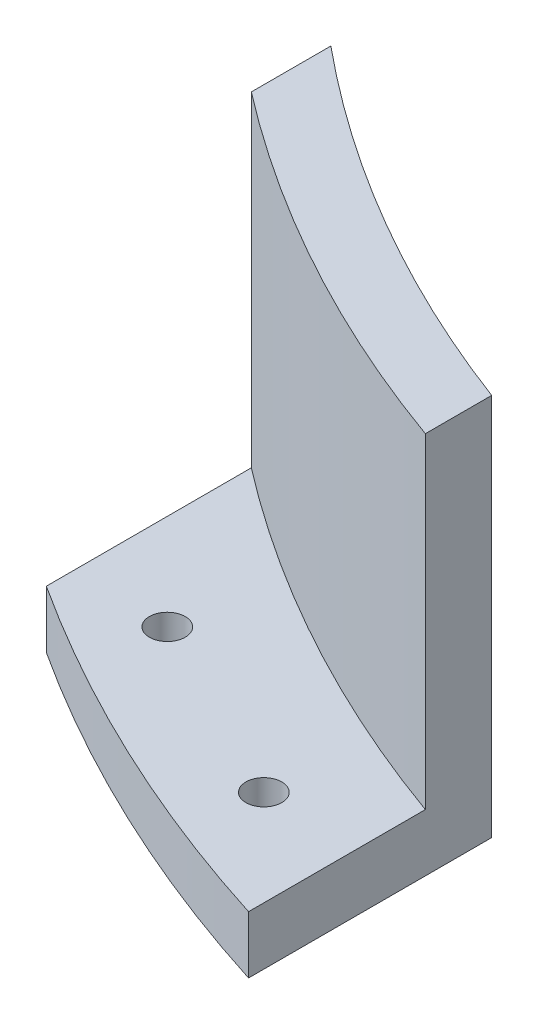
ISO-10303-21;
HEADER;
FILE_DESCRIPTION(('STEP AP214'),'2;1');
FILE_NAME('part.step','',(''),(''),'','','');
FILE_SCHEMA(('AUTOMOTIVE_DESIGN { 1 0 10303 214 1 1 1 1 }'));
ENDSEC;
DATA;
#1=APPLICATION_CONTEXT('core data for automotive mechanical design processes');
#2=APPLICATION_PROTOCOL_DEFINITION('international standard','automotive_design',2000,#1);
#3=PRODUCT_CONTEXT('',#1,'mechanical');
#4=PRODUCT('Part','Part','',(#3));
#5=PRODUCT_RELATED_PRODUCT_CATEGORY('part','',(#4));
#6=PRODUCT_DEFINITION_FORMATION('','',#4);
#7=PRODUCT_DEFINITION_CONTEXT('part definition',#1,'design');
#8=PRODUCT_DEFINITION('design','',#6,#7);
#9=PRODUCT_DEFINITION_SHAPE('','',#8);
#10=(LENGTH_UNIT() NAMED_UNIT(*) SI_UNIT(.MILLI.,.METRE.));
#11=(NAMED_UNIT(*) PLANE_ANGLE_UNIT() SI_UNIT($,.RADIAN.));
#12=(NAMED_UNIT(*) SI_UNIT($,.STERADIAN.) SOLID_ANGLE_UNIT());
#13=UNCERTAINTY_MEASURE_WITH_UNIT(LENGTH_MEASURE(1.E-05),#10,'distance_accuracy_value','');
#14=(GEOMETRIC_REPRESENTATION_CONTEXT(3) GLOBAL_UNCERTAINTY_ASSIGNED_CONTEXT((#13)) GLOBAL_UNIT_ASSIGNED_CONTEXT((#10,
#11,#12)) REPRESENTATION_CONTEXT('',''));
#15=CARTESIAN_POINT('',(0.,0.,0.));
#16=DIRECTION('',(0.,0.,1.));
#17=DIRECTION('',(1.,0.,0.));
#18=AXIS2_PLACEMENT_3D('',#15,#16,#17);
#19=CARTESIAN_POINT('',(-114.033720515136,50.8,0.));
#20=DIRECTION('',(1.,0.,0.));
#21=DIRECTION('',(0.,0.,-1.));
#22=AXIS2_PLACEMENT_3D('',#19,#20,#21);
#23=PLANE('',#22);
#24=DIRECTION('',(0.,0.,1.));
#25=VECTOR('',#24,1.);
#26=CARTESIAN_POINT('',(-114.033720515136,7.62,0.));
#27=LINE('',#26,#25);
#28=CARTESIAN_POINT('',(-114.033720515136,7.62,148.616843629771));
#29=VERTEX_POINT('',#28);
#30=CARTESIAN_POINT('',(-114.033720515136,7.62,175.805327238613));
#31=VERTEX_POINT('',#30);
#32=EDGE_CURVE('E99',#29,#31,#27,.T.);
#33=ORIENTED_EDGE('',*,*,#32,.F.);
#34=DIRECTION('',(0.,1.,0.));
#35=VECTOR('',#34,1.);
#36=CARTESIAN_POINT('',(-114.033720515136,7.62,148.616843629771));
#37=LINE('',#36,#35);
#38=CARTESIAN_POINT('',(-114.033720515136,50.8,148.616843629771));
#39=VERTEX_POINT('',#38);
#40=EDGE_CURVE('E131',#39,#29,#37,.F.);
#41=ORIENTED_EDGE('',*,*,#40,.F.);
#42=DIRECTION('',(0.,0.,1.));
#43=VECTOR('',#42,1.);
#44=CARTESIAN_POINT('',(-114.033720515136,50.8,0.));
#45=LINE('',#44,#43);
#46=CARTESIAN_POINT('',(-114.033720515136,50.8,138.066561793491));
#47=VERTEX_POINT('',#46);
#48=EDGE_CURVE('E86',#47,#39,#45,.T.);
#49=ORIENTED_EDGE('',*,*,#48,.F.);
#50=DIRECTION('',(0.,-1.,0.));
#51=VECTOR('',#50,1.);
#52=CARTESIAN_POINT('',(-114.033720515136,50.8,138.066561793491));
#53=LINE('',#52,#51);
#54=CARTESIAN_POINT('',(-114.033720515136,0.,138.066561793491));
#55=VERTEX_POINT('',#54);
#56=EDGE_CURVE('E62',#47,#55,#53,.T.);
#57=ORIENTED_EDGE('',*,*,#56,.T.);
#58=DIRECTION('',(0.,0.,1.));
#59=VECTOR('',#58,1.);
#60=CARTESIAN_POINT('',(-114.033720515136,0.,0.));
#61=LINE('',#60,#59);
#62=CARTESIAN_POINT('',(-114.033720515136,0.,175.805327238613));
#63=VERTEX_POINT('',#62);
#64=EDGE_CURVE('E83',#55,#63,#61,.T.);
#65=ORIENTED_EDGE('',*,*,#64,.T.);
#66=DIRECTION('',(0.,-1.,0.));
#67=VECTOR('',#66,1.);
#68=CARTESIAN_POINT('',(-114.033720515136,50.8,175.805327238613));
#69=LINE('',#68,#67);
#70=EDGE_CURVE('E46',#31,#63,#69,.T.);
#71=ORIENTED_EDGE('',*,*,#70,.F.);
#72=EDGE_LOOP('',(#33,#41,#49,#57,#65,#71));
#73=FACE_BOUND('',#72,.T.);
#74=ADVANCED_FACE('F39',(#73),#23,.F.);
#75=CARTESIAN_POINT('',(0.,50.8,0.));
#76=DIRECTION('',(0.,-1.,0.));
#77=DIRECTION('',(0.,0.,-1.));
#78=AXIS2_PLACEMENT_3D('',#75,#76,#77);
#79=CYLINDRICAL_SURFACE('',#78,209.55);
#80=CARTESIAN_POINT('',(0.,7.62,0.));
#81=DIRECTION('',(0.,1.,0.));
#82=DIRECTION('',(0.,0.,1.));
#83=AXIS2_PLACEMENT_3D('',#80,#81,#82);
#84=CIRCLE('',#83,209.55);
#85=CARTESIAN_POINT('',(-63.2337205151356,7.62,199.781628509264));
#86=VERTEX_POINT('',#85);
#87=EDGE_CURVE('E118',#31,#86,#84,.T.);
#88=ORIENTED_EDGE('',*,*,#87,.F.);
#89=ORIENTED_EDGE('',*,*,#70,.T.);
#90=CARTESIAN_POINT('',(0.,0.,0.));
#91=DIRECTION('',(0.,1.,0.));
#92=DIRECTION('',(0.,0.,1.));
#93=AXIS2_PLACEMENT_3D('',#90,#91,#92);
#94=CIRCLE('',#93,209.55);
#95=CARTESIAN_POINT('',(-63.2337205151356,0.,199.781628509264));
#96=VERTEX_POINT('',#95);
#97=EDGE_CURVE('E98',#63,#96,#94,.T.);
#98=ORIENTED_EDGE('',*,*,#97,.T.);
#99=DIRECTION('',(0.,-1.,0.));
#100=VECTOR('',#99,1.);
#101=CARTESIAN_POINT('',(-63.2337205151356,50.8,199.781628509264));
#102=LINE('',#101,#100);
#103=EDGE_CURVE('E111',#86,#96,#102,.T.);
#104=ORIENTED_EDGE('',*,*,#103,.F.);
#105=EDGE_LOOP('',(#88,#89,#98,#104));
#106=FACE_BOUND('',#105,.T.);
#107=ADVANCED_FACE('F114',(#106),#79,.T.);
#108=CARTESIAN_POINT('',(-63.2337205151355,50.8,0.));
#109=DIRECTION('',(1.,0.,0.));
#110=DIRECTION('',(0.,0.,-1.));
#111=AXIS2_PLACEMENT_3D('',#108,#109,#110);
#112=PLANE('',#111);
#113=DIRECTION('',(0.,1.,0.));
#114=VECTOR('',#113,1.);
#115=CARTESIAN_POINT('',(-63.2337205151356,7.62,176.329669128067));
#116=LINE('',#115,#114);
#117=CARTESIAN_POINT('',(-63.2337205151356,50.8,176.329669128067));
#118=VERTEX_POINT('',#117);
#119=CARTESIAN_POINT('',(-63.2337205151356,7.62,176.329669128067));
#120=VERTEX_POINT('',#119);
#121=EDGE_CURVE('E53',#118,#120,#116,.F.);
#122=ORIENTED_EDGE('',*,*,#121,.T.);
#123=DIRECTION('',(0.,0.,1.));
#124=VECTOR('',#123,1.);
#125=CARTESIAN_POINT('',(-63.2337205151355,7.62,0.));
#126=LINE('',#125,#124);
#127=EDGE_CURVE('E11',#120,#86,#126,.T.);
#128=ORIENTED_EDGE('',*,*,#127,.T.);
#129=ORIENTED_EDGE('',*,*,#103,.T.);
#130=DIRECTION('',(0.,0.,1.));
#131=VECTOR('',#130,1.);
#132=CARTESIAN_POINT('',(-63.2337205151355,0.,0.));
#133=LINE('',#132,#131);
#134=CARTESIAN_POINT('',(-63.2337205151356,0.,167.533762238582));
#135=VERTEX_POINT('',#134);
#136=EDGE_CURVE('E103',#135,#96,#133,.T.);
#137=ORIENTED_EDGE('',*,*,#136,.F.);
#138=DIRECTION('',(0.,-1.,0.));
#139=VECTOR('',#138,1.);
#140=CARTESIAN_POINT('',(-63.2337205151356,50.8,167.533762238582));
#141=LINE('',#140,#139);
#142=CARTESIAN_POINT('',(-63.2337205151356,50.8,167.533762238582));
#143=VERTEX_POINT('',#142);
#144=EDGE_CURVE('E88',#143,#135,#141,.T.);
#145=ORIENTED_EDGE('',*,*,#144,.F.);
#146=DIRECTION('',(0.,0.,1.));
#147=VECTOR('',#146,1.);
#148=CARTESIAN_POINT('',(-63.2337205151355,50.8,0.));
#149=LINE('',#148,#147);
#150=EDGE_CURVE('E105',#143,#118,#149,.T.);
#151=ORIENTED_EDGE('',*,*,#150,.T.);
#152=EDGE_LOOP('',(#122,#128,#129,#137,#145,#151));
#153=FACE_BOUND('',#152,.T.);
#154=ADVANCED_FACE('F152',(#153),#112,.T.);
#155=CARTESIAN_POINT('',(0.,50.8,0.));
#156=DIRECTION('',(0.,1.,0.));
#157=DIRECTION('',(0.,0.,1.));
#158=AXIS2_PLACEMENT_3D('',#155,#156,#157);
#159=PLANE('',#158);
#160=ORIENTED_EDGE('',*,*,#48,.T.);
#161=CARTESIAN_POINT('',(0.,50.8,0.));
#162=DIRECTION('',(0.,1.,0.));
#163=DIRECTION('',(0.,0.,1.));
#164=AXIS2_PLACEMENT_3D('',#161,#162,#163);
#165=CIRCLE('',#164,187.325);
#166=EDGE_CURVE('E134',#39,#118,#165,.T.);
#167=ORIENTED_EDGE('',*,*,#166,.T.);
#168=ORIENTED_EDGE('',*,*,#150,.F.);
#169=CARTESIAN_POINT('',(0.,50.8,0.));
#170=DIRECTION('',(0.,1.,0.));
#171=DIRECTION('',(0.,0.,1.));
#172=AXIS2_PLACEMENT_3D('',#169,#170,#171);
#173=CIRCLE('',#172,179.07);
#174=EDGE_CURVE('E89',#47,#143,#173,.T.);
#175=ORIENTED_EDGE('',*,*,#174,.F.);
#176=EDGE_LOOP('',(#160,#167,#168,#175));
#177=FACE_BOUND('',#176,.T.);
#178=ADVANCED_FACE('F150',(#177),#159,.T.);
#179=CARTESIAN_POINT('',(0.,50.8,0.));
#180=DIRECTION('',(0.,-1.,0.));
#181=DIRECTION('',(0.,0.,-1.));
#182=AXIS2_PLACEMENT_3D('',#179,#180,#181);
#183=CYLINDRICAL_SURFACE('',#182,179.07);
#184=CARTESIAN_POINT('',(0.,0.,0.));
#185=DIRECTION('',(0.,1.,0.));
#186=DIRECTION('',(0.,0.,1.));
#187=AXIS2_PLACEMENT_3D('',#184,#185,#186);
#188=CIRCLE('',#187,179.07);
#189=EDGE_CURVE('E96',#55,#135,#188,.T.);
#190=ORIENTED_EDGE('',*,*,#189,.F.);
#191=ORIENTED_EDGE('',*,*,#56,.F.);
#192=ORIENTED_EDGE('',*,*,#174,.T.);
#193=ORIENTED_EDGE('',*,*,#144,.T.);
#194=EDGE_LOOP('',(#190,#191,#192,#193));
#195=FACE_BOUND('',#194,.T.);
#196=ADVANCED_FACE('F101',(#195),#183,.F.);
#197=CARTESIAN_POINT('',(0.,0.,0.));
#198=DIRECTION('',(0.,1.,0.));
#199=DIRECTION('',(0.,0.,1.));
#200=AXIS2_PLACEMENT_3D('',#197,#198,#199);
#201=PLANE('',#200);
#202=CARTESIAN_POINT('',(-101.333720515136,0.,172.457176457115));
#203=DIRECTION('',(0.,1.,0.));
#204=DIRECTION('',(0.,0.,1.));
#205=AXIS2_PLACEMENT_3D('',#202,#203,#204);
#206=CIRCLE('',#205,2.38125);
#207=CARTESIAN_POINT('',(-101.333720515136,0.,174.838426457115));
#208=VERTEX_POINT('',#207);
#209=EDGE_CURVE('E139',#208,#208,#206,.T.);
#210=ORIENTED_EDGE('',*,*,#209,.T.);
#211=EDGE_LOOP('',(#210));
#212=FACE_BOUND('',#211,.T.);
#213=CARTESIAN_POINT('',(-75.9337205151356,0.,185.051535291468));
#214=DIRECTION('',(0.,1.,0.));
#215=DIRECTION('',(0.,0.,1.));
#216=AXIS2_PLACEMENT_3D('',#213,#214,#215);
#217=CIRCLE('',#216,2.38125);
#218=CARTESIAN_POINT('',(-75.9337205151356,0.,187.432785291468));
#219=VERTEX_POINT('',#218);
#220=EDGE_CURVE('E263',#219,#219,#217,.T.);
#221=ORIENTED_EDGE('',*,*,#220,.T.);
#222=EDGE_LOOP('',(#221));
#223=FACE_BOUND('',#222,.T.);
#224=ORIENTED_EDGE('',*,*,#64,.F.);
#225=ORIENTED_EDGE('',*,*,#189,.T.);
#226=ORIENTED_EDGE('',*,*,#136,.T.);
#227=ORIENTED_EDGE('',*,*,#97,.F.);
#228=EDGE_LOOP('',(#224,#225,#226,#227));
#229=FACE_BOUND('',#228,.T.);
#230=ADVANCED_FACE('F94',(#212,#223,#229),#201,.F.);
#231=CARTESIAN_POINT('',(0.,7.62,0.));
#232=DIRECTION('',(0.,1.,0.));
#233=DIRECTION('',(0.,0.,1.));
#234=AXIS2_PLACEMENT_3D('',#231,#232,#233);
#235=PLANE('',#234);
#236=CARTESIAN_POINT('',(-101.333720515136,7.62,172.457176457115));
#237=DIRECTION('',(0.,1.,0.));
#238=DIRECTION('',(0.,0.,1.));
#239=AXIS2_PLACEMENT_3D('',#236,#237,#238);
#240=CIRCLE('',#239,2.38125);
#241=CARTESIAN_POINT('',(-101.333720515136,7.62,174.838426457115));
#242=VERTEX_POINT('',#241);
#243=EDGE_CURVE('E260',#242,#242,#240,.T.);
#244=ORIENTED_EDGE('',*,*,#243,.F.);
#245=EDGE_LOOP('',(#244));
#246=FACE_BOUND('',#245,.T.);
#247=CARTESIAN_POINT('',(-75.9337205151356,7.62,185.051535291468));
#248=DIRECTION('',(0.,1.,0.));
#249=DIRECTION('',(0.,0.,1.));
#250=AXIS2_PLACEMENT_3D('',#247,#248,#249);
#251=CIRCLE('',#250,2.38125);
#252=CARTESIAN_POINT('',(-75.9337205151356,7.62,187.432785291468));
#253=VERTEX_POINT('',#252);
#254=EDGE_CURVE('E267',#253,#253,#251,.T.);
#255=ORIENTED_EDGE('',*,*,#254,.F.);
#256=EDGE_LOOP('',(#255));
#257=FACE_BOUND('',#256,.T.);
#258=ORIENTED_EDGE('',*,*,#32,.T.);
#259=ORIENTED_EDGE('',*,*,#87,.T.);
#260=ORIENTED_EDGE('',*,*,#127,.F.);
#261=CARTESIAN_POINT('',(0.,7.62,0.));
#262=DIRECTION('',(0.,1.,0.));
#263=DIRECTION('',(0.,0.,1.));
#264=AXIS2_PLACEMENT_3D('',#261,#262,#263);
#265=CIRCLE('',#264,187.325);
#266=EDGE_CURVE('E133',#29,#120,#265,.T.);
#267=ORIENTED_EDGE('',*,*,#266,.F.);
#268=EDGE_LOOP('',(#258,#259,#260,#267));
#269=FACE_BOUND('',#268,.T.);
#270=ADVANCED_FACE('F136',(#246,#257,#269),#235,.T.);
#271=CARTESIAN_POINT('',(0.,7.62,0.));
#272=DIRECTION('',(0.,1.,0.));
#273=DIRECTION('',(0.,0.,1.));
#274=AXIS2_PLACEMENT_3D('',#271,#272,#273);
#275=CYLINDRICAL_SURFACE('',#274,187.325);
#276=ORIENTED_EDGE('',*,*,#40,.T.);
#277=ORIENTED_EDGE('',*,*,#266,.T.);
#278=ORIENTED_EDGE('',*,*,#121,.F.);
#279=ORIENTED_EDGE('',*,*,#166,.F.);
#280=EDGE_LOOP('',(#276,#277,#278,#279));
#281=FACE_BOUND('',#280,.T.);
#282=ADVANCED_FACE('F132',(#281),#275,.T.);
#283=CARTESIAN_POINT('',(-75.9337205151356,-35.56,185.051535291468));
#284=DIRECTION('',(0.,1.,0.));
#285=DIRECTION('',(0.,0.,1.));
#286=AXIS2_PLACEMENT_3D('',#283,#284,#285);
#287=CYLINDRICAL_SURFACE('',#286,2.38125);
#288=ORIENTED_EDGE('',*,*,#254,.T.);
#289=EDGE_LOOP('',(#288));
#290=FACE_BOUND('',#289,.T.);
#291=ORIENTED_EDGE('',*,*,#220,.F.);
#292=EDGE_LOOP('',(#291));
#293=FACE_BOUND('',#292,.T.);
#294=ADVANCED_FACE('F190',(#290,#293),#287,.F.);
#295=CARTESIAN_POINT('',(-101.333720515136,-35.56,172.457176457115));
#296=DIRECTION('',(0.,1.,0.));
#297=DIRECTION('',(0.,0.,1.));
#298=AXIS2_PLACEMENT_3D('',#295,#296,#297);
#299=CYLINDRICAL_SURFACE('',#298,2.38125);
#300=ORIENTED_EDGE('',*,*,#243,.T.);
#301=EDGE_LOOP('',(#300));
#302=FACE_BOUND('',#301,.T.);
#303=ORIENTED_EDGE('',*,*,#209,.F.);
#304=EDGE_LOOP('',(#303));
#305=FACE_BOUND('',#304,.T.);
#306=ADVANCED_FACE('F221',(#302,#305),#299,.F.);
#307=CLOSED_SHELL('',(#74,#107,#154,#178,#196,#230,#270,#282,#294,#306));
#308=MANIFOLD_SOLID_BREP('B2',#307);
#309=ADVANCED_BREP_SHAPE_REPRESENTATION('',(#18,#308),#14);
#310=SHAPE_DEFINITION_REPRESENTATION(#9,#309);
ENDSEC;
END-ISO-10303-21;
